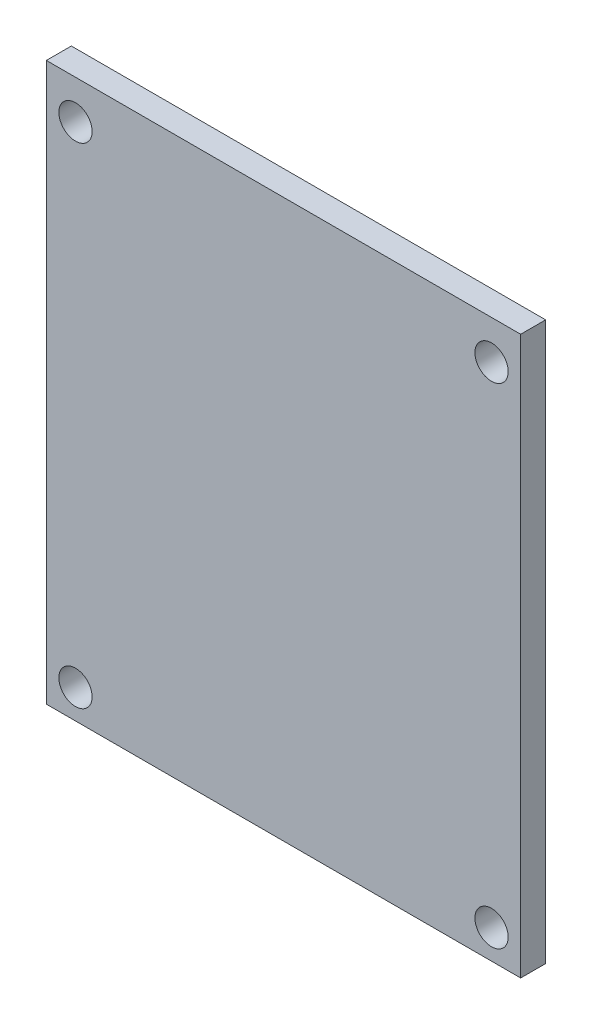
ISO-10303-21;
HEADER;
FILE_DESCRIPTION(('STEP AP214'),'2;1');
FILE_NAME('part.step','',(''),(''),'','','');
FILE_SCHEMA(('AUTOMOTIVE_DESIGN { 1 0 10303 214 1 1 1 1 }'));
ENDSEC;
DATA;
#1=APPLICATION_CONTEXT('core data for automotive mechanical design processes');
#2=APPLICATION_PROTOCOL_DEFINITION('international standard','automotive_design',2000,#1);
#3=PRODUCT_CONTEXT('',#1,'mechanical');
#4=PRODUCT('Part','Part','',(#3));
#5=PRODUCT_RELATED_PRODUCT_CATEGORY('part','',(#4));
#6=PRODUCT_DEFINITION_FORMATION('','',#4);
#7=PRODUCT_DEFINITION_CONTEXT('part definition',#1,'design');
#8=PRODUCT_DEFINITION('design','',#6,#7);
#9=PRODUCT_DEFINITION_SHAPE('','',#8);
#10=(LENGTH_UNIT() NAMED_UNIT(*) SI_UNIT(.MILLI.,.METRE.));
#11=(NAMED_UNIT(*) PLANE_ANGLE_UNIT() SI_UNIT($,.RADIAN.));
#12=(NAMED_UNIT(*) SI_UNIT($,.STERADIAN.) SOLID_ANGLE_UNIT());
#13=UNCERTAINTY_MEASURE_WITH_UNIT(LENGTH_MEASURE(1.E-05),#10,'distance_accuracy_value','');
#14=(GEOMETRIC_REPRESENTATION_CONTEXT(3) GLOBAL_UNCERTAINTY_ASSIGNED_CONTEXT((#13)) GLOBAL_UNIT_ASSIGNED_CONTEXT((#10,
#11,#12)) REPRESENTATION_CONTEXT('',''));
#15=CARTESIAN_POINT('',(0.,0.,0.));
#16=DIRECTION('',(0.,0.,1.));
#17=DIRECTION('',(1.,0.,0.));
#18=AXIS2_PLACEMENT_3D('',#15,#16,#17);
#19=CARTESIAN_POINT('',(0.,0.,3.));
#20=DIRECTION('',(0.,0.,-1.));
#21=DIRECTION('',(-1.,0.,0.));
#22=AXIS2_PLACEMENT_3D('',#19,#20,#21);
#23=PLANE('',#22);
#24=DIRECTION('',(0.,-1.,0.));
#25=VECTOR('',#24,1.);
#26=CARTESIAN_POINT('',(0.,0.,3.));
#27=LINE('',#26,#25);
#28=CARTESIAN_POINT('',(0.,67.,3.));
#29=VERTEX_POINT('',#28);
#30=CARTESIAN_POINT('',(0.,0.,3.));
#31=VERTEX_POINT('',#30);
#32=EDGE_CURVE('E222',#29,#31,#27,.T.);
#33=ORIENTED_EDGE('',*,*,#32,.T.);
#34=DIRECTION('',(1.,0.,0.));
#35=VECTOR('',#34,1.);
#36=CARTESIAN_POINT('',(0.,0.,3.));
#37=LINE('',#36,#35);
#38=CARTESIAN_POINT('',(57.,0.,3.));
#39=VERTEX_POINT('',#38);
#40=EDGE_CURVE('E226',#31,#39,#37,.T.);
#41=ORIENTED_EDGE('',*,*,#40,.T.);
#42=DIRECTION('',(0.,1.,0.));
#43=VECTOR('',#42,1.);
#44=CARTESIAN_POINT('',(57.,0.,3.));
#45=LINE('',#44,#43);
#46=CARTESIAN_POINT('',(57.,67.,3.));
#47=VERTEX_POINT('',#46);
#48=EDGE_CURVE('E230',#39,#47,#45,.T.);
#49=ORIENTED_EDGE('',*,*,#48,.T.);
#50=DIRECTION('',(-1.,0.,0.));
#51=VECTOR('',#50,1.);
#52=CARTESIAN_POINT('',(0.,67.,3.));
#53=LINE('',#52,#51);
#54=EDGE_CURVE('E233',#47,#29,#53,.T.);
#55=ORIENTED_EDGE('',*,*,#54,.T.);
#56=EDGE_LOOP('',(#33,#41,#49,#55));
#57=FACE_BOUND('',#56,.T.);
#58=CARTESIAN_POINT('',(3.5,62.3501657902684,3.));
#59=DIRECTION('',(0.,0.,1.));
#60=DIRECTION('',(1.,0.,0.));
#61=AXIS2_PLACEMENT_3D('',#58,#59,#60);
#62=CIRCLE('',#61,2.);
#63=CARTESIAN_POINT('',(5.5,62.3501657902684,3.));
#64=VERTEX_POINT('',#63);
#65=EDGE_CURVE('E214',#64,#64,#62,.T.);
#66=ORIENTED_EDGE('',*,*,#65,.F.);
#67=EDGE_LOOP('',(#66));
#68=FACE_BOUND('',#67,.T.);
#69=CARTESIAN_POINT('',(53.5,62.3501657902684,3.));
#70=DIRECTION('',(0.,0.,1.));
#71=DIRECTION('',(1.,0.,0.));
#72=AXIS2_PLACEMENT_3D('',#69,#70,#71);
#73=CIRCLE('',#72,2.);
#74=CARTESIAN_POINT('',(55.5,62.3501657902684,3.));
#75=VERTEX_POINT('',#74);
#76=EDGE_CURVE('E206',#75,#75,#73,.T.);
#77=ORIENTED_EDGE('',*,*,#76,.F.);
#78=EDGE_LOOP('',(#77));
#79=FACE_BOUND('',#78,.T.);
#80=CARTESIAN_POINT('',(53.5,3.5,3.));
#81=DIRECTION('',(0.,0.,1.));
#82=DIRECTION('',(1.,0.,0.));
#83=AXIS2_PLACEMENT_3D('',#80,#81,#82);
#84=CIRCLE('',#83,2.);
#85=CARTESIAN_POINT('',(55.5,3.5,3.));
#86=VERTEX_POINT('',#85);
#87=EDGE_CURVE('E198',#86,#86,#84,.T.);
#88=ORIENTED_EDGE('',*,*,#87,.F.);
#89=EDGE_LOOP('',(#88));
#90=FACE_BOUND('',#89,.T.);
#91=CARTESIAN_POINT('',(3.5,3.5,3.));
#92=DIRECTION('',(0.,0.,1.));
#93=DIRECTION('',(1.,0.,0.));
#94=AXIS2_PLACEMENT_3D('',#91,#92,#93);
#95=CIRCLE('',#94,2.);
#96=CARTESIAN_POINT('',(5.5,3.5,3.));
#97=VERTEX_POINT('',#96);
#98=EDGE_CURVE('E190',#97,#97,#95,.T.);
#99=ORIENTED_EDGE('',*,*,#98,.F.);
#100=EDGE_LOOP('',(#99));
#101=FACE_BOUND('',#100,.T.);
#102=ADVANCED_FACE('F39',(#57,#68,#79,#90,#101),#23,.F.);
#103=CARTESIAN_POINT('',(0.,0.,0.));
#104=DIRECTION('',(0.,0.,-1.));
#105=DIRECTION('',(-1.,0.,0.));
#106=AXIS2_PLACEMENT_3D('',#103,#104,#105);
#107=PLANE('',#106);
#108=DIRECTION('',(1.,0.,0.));
#109=VECTOR('',#108,1.);
#110=CARTESIAN_POINT('',(21.3965882981046,31.3884273724998,0.));
#111=LINE('',#110,#109);
#112=CARTESIAN_POINT('',(21.3965882981046,31.3884273724998,0.));
#113=VERTEX_POINT('',#112);
#114=CARTESIAN_POINT('',(41.3965882981047,31.3884273724998,0.));
#115=VERTEX_POINT('',#114);
#116=EDGE_CURVE('E161',#113,#115,#111,.T.);
#117=ORIENTED_EDGE('',*,*,#116,.T.);
#118=DIRECTION('',(0.,1.,0.));
#119=VECTOR('',#118,1.);
#120=CARTESIAN_POINT('',(41.3965882981047,31.3884273724998,0.));
#121=LINE('',#120,#119);
#122=CARTESIAN_POINT('',(41.3965882981047,33.1832991673716,0.));
#123=VERTEX_POINT('',#122);
#124=EDGE_CURVE('E122',#115,#123,#121,.T.);
#125=ORIENTED_EDGE('',*,*,#124,.T.);
#126=DIRECTION('',(-1.,0.,0.));
#127=VECTOR('',#126,1.);
#128=CARTESIAN_POINT('',(41.3965882981047,33.1832991673716,0.));
#129=LINE('',#128,#127);
#130=CARTESIAN_POINT('',(23.4478703493867,33.1832991673716,0.));
#131=VERTEX_POINT('',#130);
#132=EDGE_CURVE('E166',#123,#131,#129,.T.);
#133=ORIENTED_EDGE('',*,*,#132,.T.);
#134=DIRECTION('',(0.,1.,0.));
#135=VECTOR('',#134,1.);
#136=CARTESIAN_POINT('',(23.4478703493867,33.1832991673716,0.));
#137=LINE('',#136,#135);
#138=CARTESIAN_POINT('',(23.4478703493867,40.8756068596793,0.));
#139=VERTEX_POINT('',#138);
#140=EDGE_CURVE('E169',#131,#139,#137,.T.);
#141=ORIENTED_EDGE('',*,*,#140,.T.);
#142=DIRECTION('',(-1.,0.,0.));
#143=VECTOR('',#142,1.);
#144=CARTESIAN_POINT('',(23.4478703493867,40.8756068596793,0.));
#145=LINE('',#144,#143);
#146=CARTESIAN_POINT('',(21.3965882981046,40.8756068596793,0.));
#147=VERTEX_POINT('',#146);
#148=EDGE_CURVE('E60',#139,#147,#145,.T.);
#149=ORIENTED_EDGE('',*,*,#148,.T.);
#150=DIRECTION('',(0.,-1.,0.));
#151=VECTOR('',#150,1.);
#152=CARTESIAN_POINT('',(21.3965882981046,40.8756068596793,0.));
#153=LINE('',#152,#151);
#154=EDGE_CURVE('E55',#147,#113,#153,.T.);
#155=ORIENTED_EDGE('',*,*,#154,.T.);
#156=EDGE_LOOP('',(#117,#125,#133,#141,#149,#155));
#157=FACE_BOUND('',#156,.T.);
#158=CARTESIAN_POINT('',(53.5,3.5,0.));
#159=DIRECTION('',(0.,0.,1.));
#160=DIRECTION('',(1.,0.,0.));
#161=AXIS2_PLACEMENT_3D('',#158,#159,#160);
#162=CIRCLE('',#161,2.);
#163=CARTESIAN_POINT('',(55.5,3.5,0.));
#164=VERTEX_POINT('',#163);
#165=EDGE_CURVE('E194',#164,#164,#162,.T.);
#166=ORIENTED_EDGE('',*,*,#165,.T.);
#167=EDGE_LOOP('',(#166));
#168=FACE_BOUND('',#167,.T.);
#169=CARTESIAN_POINT('',(3.5,62.3501657902684,0.));
#170=DIRECTION('',(0.,0.,1.));
#171=DIRECTION('',(1.,0.,0.));
#172=AXIS2_PLACEMENT_3D('',#169,#170,#171);
#173=CIRCLE('',#172,2.);
#174=CARTESIAN_POINT('',(5.5,62.3501657902684,0.));
#175=VERTEX_POINT('',#174);
#176=EDGE_CURVE('E210',#175,#175,#173,.T.);
#177=ORIENTED_EDGE('',*,*,#176,.T.);
#178=EDGE_LOOP('',(#177));
#179=FACE_BOUND('',#178,.T.);
#180=DIRECTION('',(0.,-1.,0.));
#181=VECTOR('',#180,1.);
#182=CARTESIAN_POINT('',(0.,0.,0.));
#183=LINE('',#182,#181);
#184=CARTESIAN_POINT('',(0.,67.,0.));
#185=VERTEX_POINT('',#184);
#186=CARTESIAN_POINT('',(0.,0.,0.));
#187=VERTEX_POINT('',#186);
#188=EDGE_CURVE('E218',#185,#187,#183,.T.);
#189=ORIENTED_EDGE('',*,*,#188,.F.);
#190=DIRECTION('',(-1.,0.,0.));
#191=VECTOR('',#190,1.);
#192=CARTESIAN_POINT('',(0.,67.,0.));
#193=LINE('',#192,#191);
#194=CARTESIAN_POINT('',(57.,67.,0.));
#195=VERTEX_POINT('',#194);
#196=EDGE_CURVE('E227',#195,#185,#193,.T.);
#197=ORIENTED_EDGE('',*,*,#196,.F.);
#198=DIRECTION('',(0.,1.,0.));
#199=VECTOR('',#198,1.);
#200=CARTESIAN_POINT('',(57.,0.,0.));
#201=LINE('',#200,#199);
#202=CARTESIAN_POINT('',(57.,0.,0.));
#203=VERTEX_POINT('',#202);
#204=EDGE_CURVE('E243',#203,#195,#201,.T.);
#205=ORIENTED_EDGE('',*,*,#204,.F.);
#206=DIRECTION('',(1.,0.,0.));
#207=VECTOR('',#206,1.);
#208=CARTESIAN_POINT('',(0.,0.,0.));
#209=LINE('',#208,#207);
#210=EDGE_CURVE('E240',#187,#203,#209,.T.);
#211=ORIENTED_EDGE('',*,*,#210,.F.);
#212=EDGE_LOOP('',(#189,#197,#205,#211));
#213=FACE_BOUND('',#212,.T.);
#214=CARTESIAN_POINT('',(53.5,62.3501657902684,0.));
#215=DIRECTION('',(0.,0.,1.));
#216=DIRECTION('',(1.,0.,0.));
#217=AXIS2_PLACEMENT_3D('',#214,#215,#216);
#218=CIRCLE('',#217,2.);
#219=CARTESIAN_POINT('',(55.5,62.3501657902684,0.));
#220=VERTEX_POINT('',#219);
#221=EDGE_CURVE('E202',#220,#220,#218,.T.);
#222=ORIENTED_EDGE('',*,*,#221,.T.);
#223=EDGE_LOOP('',(#222));
#224=FACE_BOUND('',#223,.T.);
#225=CARTESIAN_POINT('',(3.5,3.5,0.));
#226=DIRECTION('',(0.,0.,1.));
#227=DIRECTION('',(1.,0.,0.));
#228=AXIS2_PLACEMENT_3D('',#225,#226,#227);
#229=CIRCLE('',#228,2.);
#230=CARTESIAN_POINT('',(5.5,3.5,0.));
#231=VERTEX_POINT('',#230);
#232=EDGE_CURVE('E176',#231,#231,#229,.T.);
#233=ORIENTED_EDGE('',*,*,#232,.T.);
#234=EDGE_LOOP('',(#233));
#235=FACE_BOUND('',#234,.T.);
#236=ADVANCED_FACE('F266',(#157,#168,#179,#213,#224,#235),#107,.T.);
#237=CARTESIAN_POINT('',(0.,0.,3.));
#238=DIRECTION('',(1.,0.,0.));
#239=DIRECTION('',(0.,1.,0.));
#240=AXIS2_PLACEMENT_3D('',#237,#238,#239);
#241=PLANE('',#240);
#242=ORIENTED_EDGE('',*,*,#188,.T.);
#243=DIRECTION('',(0.,0.,-1.));
#244=VECTOR('',#243,1.);
#245=CARTESIAN_POINT('',(0.,0.,3.));
#246=LINE('',#245,#244);
#247=EDGE_CURVE('E11',#31,#187,#246,.T.);
#248=ORIENTED_EDGE('',*,*,#247,.F.);
#249=ORIENTED_EDGE('',*,*,#32,.F.);
#250=DIRECTION('',(0.,0.,-1.));
#251=VECTOR('',#250,1.);
#252=CARTESIAN_POINT('',(0.,67.,3.));
#253=LINE('',#252,#251);
#254=EDGE_CURVE('E236',#29,#185,#253,.T.);
#255=ORIENTED_EDGE('',*,*,#254,.T.);
#256=EDGE_LOOP('',(#242,#248,#249,#255));
#257=FACE_BOUND('',#256,.T.);
#258=ADVANCED_FACE('F41',(#257),#241,.F.);
#259=CARTESIAN_POINT('',(0.,0.,3.));
#260=DIRECTION('',(0.,1.,0.));
#261=DIRECTION('',(0.,0.,1.));
#262=AXIS2_PLACEMENT_3D('',#259,#260,#261);
#263=PLANE('',#262);
#264=ORIENTED_EDGE('',*,*,#210,.T.);
#265=DIRECTION('',(0.,0.,-1.));
#266=VECTOR('',#265,1.);
#267=CARTESIAN_POINT('',(57.,0.,3.));
#268=LINE('',#267,#266);
#269=EDGE_CURVE('E48',#39,#203,#268,.T.);
#270=ORIENTED_EDGE('',*,*,#269,.F.);
#271=ORIENTED_EDGE('',*,*,#40,.F.);
#272=ORIENTED_EDGE('',*,*,#247,.T.);
#273=EDGE_LOOP('',(#264,#270,#271,#272));
#274=FACE_BOUND('',#273,.T.);
#275=ADVANCED_FACE('F277',(#274),#263,.F.);
#276=CARTESIAN_POINT('',(57.,0.,3.));
#277=DIRECTION('',(-1.,0.,0.));
#278=DIRECTION('',(0.,0.,1.));
#279=AXIS2_PLACEMENT_3D('',#276,#277,#278);
#280=PLANE('',#279);
#281=ORIENTED_EDGE('',*,*,#204,.T.);
#282=DIRECTION('',(0.,0.,-1.));
#283=VECTOR('',#282,1.);
#284=CARTESIAN_POINT('',(57.,67.,3.));
#285=LINE('',#284,#283);
#286=EDGE_CURVE('E251',#47,#195,#285,.T.);
#287=ORIENTED_EDGE('',*,*,#286,.F.);
#288=ORIENTED_EDGE('',*,*,#48,.F.);
#289=ORIENTED_EDGE('',*,*,#269,.T.);
#290=EDGE_LOOP('',(#281,#287,#288,#289));
#291=FACE_BOUND('',#290,.T.);
#292=ADVANCED_FACE('F260',(#291),#280,.F.);
#293=CARTESIAN_POINT('',(0.,67.,3.));
#294=DIRECTION('',(0.,-1.,0.));
#295=DIRECTION('',(0.,0.,-1.));
#296=AXIS2_PLACEMENT_3D('',#293,#294,#295);
#297=PLANE('',#296);
#298=ORIENTED_EDGE('',*,*,#196,.T.);
#299=ORIENTED_EDGE('',*,*,#254,.F.);
#300=ORIENTED_EDGE('',*,*,#54,.F.);
#301=ORIENTED_EDGE('',*,*,#286,.T.);
#302=EDGE_LOOP('',(#298,#299,#300,#301));
#303=FACE_BOUND('',#302,.T.);
#304=ADVANCED_FACE('F270',(#303),#297,.F.);
#305=CARTESIAN_POINT('',(3.5,62.3501657902684,3.));
#306=DIRECTION('',(0.,0.,-1.));
#307=DIRECTION('',(-1.,0.,0.));
#308=AXIS2_PLACEMENT_3D('',#305,#306,#307);
#309=CYLINDRICAL_SURFACE('',#308,2.);
#310=ORIENTED_EDGE('',*,*,#65,.T.);
#311=EDGE_LOOP('',(#310));
#312=FACE_BOUND('',#311,.T.);
#313=ORIENTED_EDGE('',*,*,#176,.F.);
#314=EDGE_LOOP('',(#313));
#315=FACE_BOUND('',#314,.T.);
#316=ADVANCED_FACE('F291',(#312,#315),#309,.F.);
#317=CARTESIAN_POINT('',(53.5,62.3501657902684,3.));
#318=DIRECTION('',(0.,0.,-1.));
#319=DIRECTION('',(-1.,0.,0.));
#320=AXIS2_PLACEMENT_3D('',#317,#318,#319);
#321=CYLINDRICAL_SURFACE('',#320,2.);
#322=ORIENTED_EDGE('',*,*,#76,.T.);
#323=EDGE_LOOP('',(#322));
#324=FACE_BOUND('',#323,.T.);
#325=ORIENTED_EDGE('',*,*,#221,.F.);
#326=EDGE_LOOP('',(#325));
#327=FACE_BOUND('',#326,.T.);
#328=ADVANCED_FACE('F298',(#324,#327),#321,.F.);
#329=CARTESIAN_POINT('',(53.5,3.5,3.));
#330=DIRECTION('',(0.,0.,-1.));
#331=DIRECTION('',(-1.,0.,0.));
#332=AXIS2_PLACEMENT_3D('',#329,#330,#331);
#333=CYLINDRICAL_SURFACE('',#332,2.);
#334=ORIENTED_EDGE('',*,*,#87,.T.);
#335=EDGE_LOOP('',(#334));
#336=FACE_BOUND('',#335,.T.);
#337=ORIENTED_EDGE('',*,*,#165,.F.);
#338=EDGE_LOOP('',(#337));
#339=FACE_BOUND('',#338,.T.);
#340=ADVANCED_FACE('F303',(#336,#339),#333,.F.);
#341=CARTESIAN_POINT('',(3.5,3.5,3.));
#342=DIRECTION('',(0.,0.,-1.));
#343=DIRECTION('',(-1.,0.,0.));
#344=AXIS2_PLACEMENT_3D('',#341,#342,#343);
#345=CYLINDRICAL_SURFACE('',#344,2.);
#346=ORIENTED_EDGE('',*,*,#98,.T.);
#347=EDGE_LOOP('',(#346));
#348=FACE_BOUND('',#347,.T.);
#349=ORIENTED_EDGE('',*,*,#232,.F.);
#350=EDGE_LOOP('',(#349));
#351=FACE_BOUND('',#350,.T.);
#352=ADVANCED_FACE('F316',(#348,#351),#345,.F.);
#353=CARTESIAN_POINT('',(21.3965882981046,31.3884273724998,-1.));
#354=DIRECTION('',(0.,-1.,0.));
#355=DIRECTION('',(0.,0.,-1.));
#356=AXIS2_PLACEMENT_3D('',#353,#354,#355);
#357=PLANE('',#356);
#358=ORIENTED_EDGE('',*,*,#116,.F.);
#359=DIRECTION('',(0.,0.,1.));
#360=VECTOR('',#359,1.);
#361=CARTESIAN_POINT('',(21.3965882981046,31.3884273724998,-1.));
#362=LINE('',#361,#360);
#363=CARTESIAN_POINT('',(21.3965882981046,31.3884273724998,-1.));
#364=VERTEX_POINT('',#363);
#365=EDGE_CURVE('E143',#364,#113,#362,.T.);
#366=ORIENTED_EDGE('',*,*,#365,.F.);
#367=DIRECTION('',(1.,0.,0.));
#368=VECTOR('',#367,1.);
#369=CARTESIAN_POINT('',(21.3965882981046,31.3884273724998,-1.));
#370=LINE('',#369,#368);
#371=CARTESIAN_POINT('',(41.3965882981047,31.3884273724998,-1.));
#372=VERTEX_POINT('',#371);
#373=EDGE_CURVE('E135',#364,#372,#370,.T.);
#374=ORIENTED_EDGE('',*,*,#373,.T.);
#375=DIRECTION('',(0.,0.,1.));
#376=VECTOR('',#375,1.);
#377=CARTESIAN_POINT('',(41.3965882981047,31.3884273724998,-1.));
#378=LINE('',#377,#376);
#379=EDGE_CURVE('E117',#372,#115,#378,.T.);
#380=ORIENTED_EDGE('',*,*,#379,.T.);
#381=EDGE_LOOP('',(#358,#366,#374,#380));
#382=FACE_BOUND('',#381,.T.);
#383=ADVANCED_FACE('F142',(#382),#357,.T.);
#384=CARTESIAN_POINT('',(21.3965882981046,40.8756068596793,-1.));
#385=DIRECTION('',(-1.,0.,0.));
#386=DIRECTION('',(0.,0.,1.));
#387=AXIS2_PLACEMENT_3D('',#384,#385,#386);
#388=PLANE('',#387);
#389=ORIENTED_EDGE('',*,*,#154,.F.);
#390=DIRECTION('',(0.,0.,1.));
#391=VECTOR('',#390,1.);
#392=CARTESIAN_POINT('',(21.3965882981046,40.8756068596793,-1.));
#393=LINE('',#392,#391);
#394=CARTESIAN_POINT('',(21.3965882981046,40.8756068596793,-1.));
#395=VERTEX_POINT('',#394);
#396=EDGE_CURVE('E177',#395,#147,#393,.T.);
#397=ORIENTED_EDGE('',*,*,#396,.F.);
#398=DIRECTION('',(0.,-1.,0.));
#399=VECTOR('',#398,1.);
#400=CARTESIAN_POINT('',(21.3965882981046,40.8756068596793,-1.));
#401=LINE('',#400,#399);
#402=EDGE_CURVE('E128',#395,#364,#401,.T.);
#403=ORIENTED_EDGE('',*,*,#402,.T.);
#404=ORIENTED_EDGE('',*,*,#365,.T.);
#405=EDGE_LOOP('',(#389,#397,#403,#404));
#406=FACE_BOUND('',#405,.T.);
#407=ADVANCED_FACE('F326',(#406),#388,.T.);
#408=CARTESIAN_POINT('',(23.4478703493867,40.8756068596793,-1.));
#409=DIRECTION('',(0.,1.,0.));
#410=DIRECTION('',(0.,0.,1.));
#411=AXIS2_PLACEMENT_3D('',#408,#409,#410);
#412=PLANE('',#411);
#413=ORIENTED_EDGE('',*,*,#148,.F.);
#414=DIRECTION('',(0.,0.,1.));
#415=VECTOR('',#414,1.);
#416=CARTESIAN_POINT('',(23.4478703493867,40.8756068596793,-1.));
#417=LINE('',#416,#415);
#418=CARTESIAN_POINT('',(23.4478703493867,40.8756068596793,-1.));
#419=VERTEX_POINT('',#418);
#420=EDGE_CURVE('E180',#419,#139,#417,.T.);
#421=ORIENTED_EDGE('',*,*,#420,.F.);
#422=DIRECTION('',(-1.,0.,0.));
#423=VECTOR('',#422,1.);
#424=CARTESIAN_POINT('',(23.4478703493867,40.8756068596793,-1.));
#425=LINE('',#424,#423);
#426=EDGE_CURVE('E155',#419,#395,#425,.T.);
#427=ORIENTED_EDGE('',*,*,#426,.T.);
#428=ORIENTED_EDGE('',*,*,#396,.T.);
#429=EDGE_LOOP('',(#413,#421,#427,#428));
#430=FACE_BOUND('',#429,.T.);
#431=ADVANCED_FACE('F340',(#430),#412,.T.);
#432=CARTESIAN_POINT('',(23.4478703493867,33.1832991673716,-1.));
#433=DIRECTION('',(1.,0.,0.));
#434=DIRECTION('',(0.,0.,-1.));
#435=AXIS2_PLACEMENT_3D('',#432,#433,#434);
#436=PLANE('',#435);
#437=ORIENTED_EDGE('',*,*,#140,.F.);
#438=DIRECTION('',(0.,0.,1.));
#439=VECTOR('',#438,1.);
#440=CARTESIAN_POINT('',(23.4478703493867,33.1832991673716,-1.));
#441=LINE('',#440,#439);
#442=CARTESIAN_POINT('',(23.4478703493867,33.1832991673716,-1.));
#443=VERTEX_POINT('',#442);
#444=EDGE_CURVE('E184',#443,#131,#441,.T.);
#445=ORIENTED_EDGE('',*,*,#444,.F.);
#446=DIRECTION('',(0.,1.,0.));
#447=VECTOR('',#446,1.);
#448=CARTESIAN_POINT('',(23.4478703493867,33.1832991673716,-1.));
#449=LINE('',#448,#447);
#450=EDGE_CURVE('E151',#443,#419,#449,.T.);
#451=ORIENTED_EDGE('',*,*,#450,.T.);
#452=ORIENTED_EDGE('',*,*,#420,.T.);
#453=EDGE_LOOP('',(#437,#445,#451,#452));
#454=FACE_BOUND('',#453,.T.);
#455=ADVANCED_FACE('F336',(#454),#436,.T.);
#456=CARTESIAN_POINT('',(41.3965882981047,33.1832991673716,-1.));
#457=DIRECTION('',(0.,1.,0.));
#458=DIRECTION('',(0.,0.,1.));
#459=AXIS2_PLACEMENT_3D('',#456,#457,#458);
#460=PLANE('',#459);
#461=ORIENTED_EDGE('',*,*,#132,.F.);
#462=DIRECTION('',(0.,0.,1.));
#463=VECTOR('',#462,1.);
#464=CARTESIAN_POINT('',(41.3965882981047,33.1832991673716,-1.));
#465=LINE('',#464,#463);
#466=CARTESIAN_POINT('',(41.3965882981047,33.1832991673716,-1.));
#467=VERTEX_POINT('',#466);
#468=EDGE_CURVE('E127',#467,#123,#465,.T.);
#469=ORIENTED_EDGE('',*,*,#468,.F.);
#470=DIRECTION('',(-1.,0.,0.));
#471=VECTOR('',#470,1.);
#472=CARTESIAN_POINT('',(41.3965882981047,33.1832991673716,-1.));
#473=LINE('',#472,#471);
#474=EDGE_CURVE('E139',#467,#443,#473,.T.);
#475=ORIENTED_EDGE('',*,*,#474,.T.);
#476=ORIENTED_EDGE('',*,*,#444,.T.);
#477=EDGE_LOOP('',(#461,#469,#475,#476));
#478=FACE_BOUND('',#477,.T.);
#479=ADVANCED_FACE('F333',(#478),#460,.T.);
#480=CARTESIAN_POINT('',(41.3965882981047,31.3884273724998,-1.));
#481=DIRECTION('',(1.,0.,0.));
#482=DIRECTION('',(0.,0.,-1.));
#483=AXIS2_PLACEMENT_3D('',#480,#481,#482);
#484=PLANE('',#483);
#485=ORIENTED_EDGE('',*,*,#124,.F.);
#486=ORIENTED_EDGE('',*,*,#379,.F.);
#487=DIRECTION('',(0.,1.,0.));
#488=VECTOR('',#487,1.);
#489=CARTESIAN_POINT('',(41.3965882981047,31.3884273724998,-1.));
#490=LINE('',#489,#488);
#491=EDGE_CURVE('E121',#372,#467,#490,.T.);
#492=ORIENTED_EDGE('',*,*,#491,.T.);
#493=ORIENTED_EDGE('',*,*,#468,.T.);
#494=EDGE_LOOP('',(#485,#486,#492,#493));
#495=FACE_BOUND('',#494,.T.);
#496=ADVANCED_FACE('F119',(#495),#484,.T.);
#497=CARTESIAN_POINT('',(0.,0.,-1.));
#498=DIRECTION('',(0.,0.,1.));
#499=DIRECTION('',(1.,0.,0.));
#500=AXIS2_PLACEMENT_3D('',#497,#498,#499);
#501=PLANE('',#500);
#502=ORIENTED_EDGE('',*,*,#373,.F.);
#503=ORIENTED_EDGE('',*,*,#402,.F.);
#504=ORIENTED_EDGE('',*,*,#426,.F.);
#505=ORIENTED_EDGE('',*,*,#450,.F.);
#506=ORIENTED_EDGE('',*,*,#474,.F.);
#507=ORIENTED_EDGE('',*,*,#491,.F.);
#508=EDGE_LOOP('',(#502,#503,#504,#505,#506,#507));
#509=FACE_BOUND('',#508,.T.);
#510=ADVANCED_FACE('F133',(#509),#501,.F.);
#511=CLOSED_SHELL('',(#102,#236,#258,#275,#292,#304,#316,#328,#340,#352,#383,#407,#431,#455,
#479,#496,#510));
#512=MANIFOLD_SOLID_BREP('B2',#511);
#513=ADVANCED_BREP_SHAPE_REPRESENTATION('',(#18,#512),#14);
#514=SHAPE_DEFINITION_REPRESENTATION(#9,#513);
ENDSEC;
END-ISO-10303-21;
